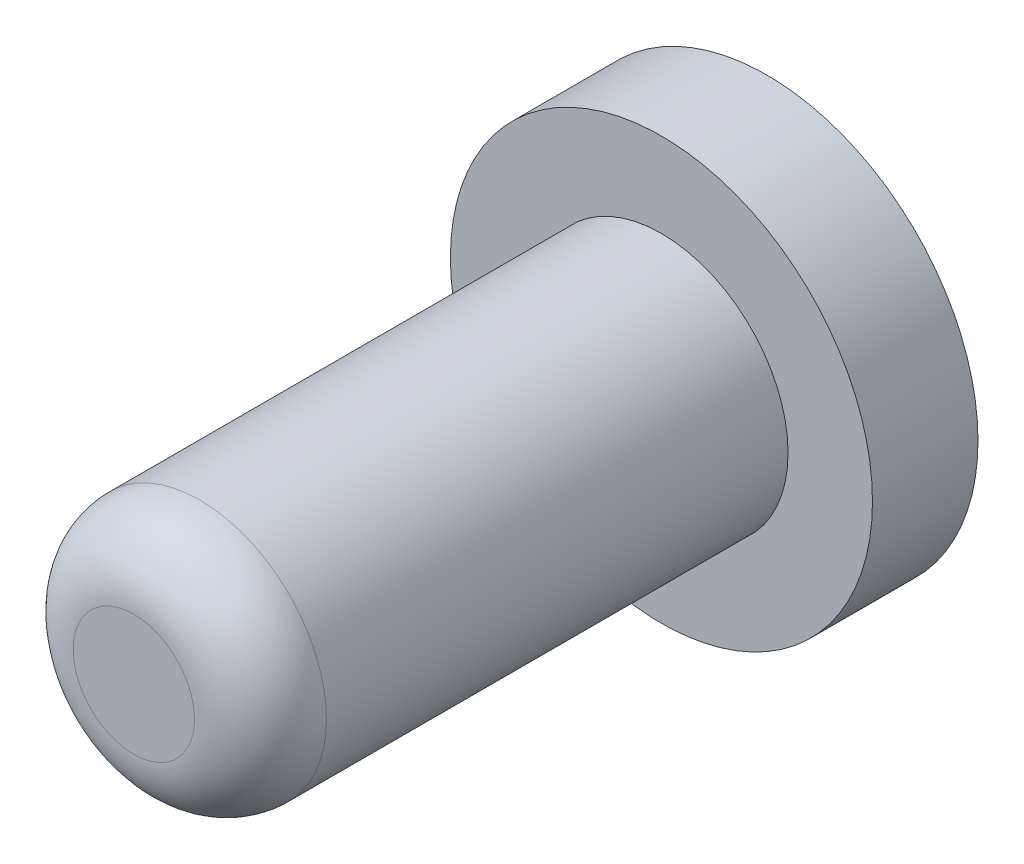
ISO-10303-21;
HEADER;
FILE_DESCRIPTION(('STEP AP214'),'2;1');
FILE_NAME('part.step','',(''),(''),'','','');
FILE_SCHEMA(('AUTOMOTIVE_DESIGN { 1 0 10303 214 1 1 1 1 }'));
ENDSEC;
DATA;
#1=APPLICATION_CONTEXT('core data for automotive mechanical design processes');
#2=APPLICATION_PROTOCOL_DEFINITION('international standard','automotive_design',2000,#1);
#3=PRODUCT_CONTEXT('',#1,'mechanical');
#4=PRODUCT('Part','Part','',(#3));
#5=PRODUCT_RELATED_PRODUCT_CATEGORY('part','',(#4));
#6=PRODUCT_DEFINITION_FORMATION('','',#4);
#7=PRODUCT_DEFINITION_CONTEXT('part definition',#1,'design');
#8=PRODUCT_DEFINITION('design','',#6,#7);
#9=PRODUCT_DEFINITION_SHAPE('','',#8);
#10=(LENGTH_UNIT() NAMED_UNIT(*) SI_UNIT(.MILLI.,.METRE.));
#11=(NAMED_UNIT(*) PLANE_ANGLE_UNIT() SI_UNIT($,.RADIAN.));
#12=(NAMED_UNIT(*) SI_UNIT($,.STERADIAN.) SOLID_ANGLE_UNIT());
#13=UNCERTAINTY_MEASURE_WITH_UNIT(LENGTH_MEASURE(1.E-05),#10,'distance_accuracy_value','');
#14=(GEOMETRIC_REPRESENTATION_CONTEXT(3) GLOBAL_UNCERTAINTY_ASSIGNED_CONTEXT((#13)) GLOBAL_UNIT_ASSIGNED_CONTEXT((#10,
#11,#12)) REPRESENTATION_CONTEXT('',''));
#15=CARTESIAN_POINT('',(0.,0.,0.));
#16=DIRECTION('',(0.,0.,1.));
#17=DIRECTION('',(1.,0.,0.));
#18=AXIS2_PLACEMENT_3D('',#15,#16,#17);
#19=CARTESIAN_POINT('',(0.,0.,-2.));
#20=DIRECTION('',(0.,0.,1.));
#21=DIRECTION('',(1.,0.,0.));
#22=AXIS2_PLACEMENT_3D('',#19,#20,#21);
#23=CYLINDRICAL_SURFACE('',#22,4.);
#24=CARTESIAN_POINT('',(0.,0.,-2.));
#25=DIRECTION('',(0.,0.,1.));
#26=DIRECTION('',(1.,0.,0.));
#27=AXIS2_PLACEMENT_3D('',#24,#25,#26);
#28=CIRCLE('',#27,4.);
#29=CARTESIAN_POINT('',(4.,0.,-2.));
#30=VERTEX_POINT('',#29);
#31=EDGE_CURVE('E49',#30,#30,#28,.T.);
#32=ORIENTED_EDGE('',*,*,#31,.T.);
#33=EDGE_LOOP('',(#32));
#34=FACE_BOUND('',#33,.T.);
#35=CARTESIAN_POINT('',(0.,0.,0.));
#36=DIRECTION('',(0.,0.,1.));
#37=DIRECTION('',(1.,0.,0.));
#38=AXIS2_PLACEMENT_3D('',#35,#36,#37);
#39=CIRCLE('',#38,4.);
#40=CARTESIAN_POINT('',(4.,0.,0.));
#41=VERTEX_POINT('',#40);
#42=EDGE_CURVE('E52',#41,#41,#39,.T.);
#43=ORIENTED_EDGE('',*,*,#42,.F.);
#44=EDGE_LOOP('',(#43));
#45=FACE_BOUND('',#44,.T.);
#46=ADVANCED_FACE('F34',(#34,#45),#23,.T.);
#47=CARTESIAN_POINT('',(0.,0.,-2.));
#48=DIRECTION('',(0.,0.,1.));
#49=DIRECTION('',(1.,0.,0.));
#50=AXIS2_PLACEMENT_3D('',#47,#48,#49);
#51=PLANE('',#50);
#52=ORIENTED_EDGE('',*,*,#31,.F.);
#53=EDGE_LOOP('',(#52));
#54=FACE_BOUND('',#53,.T.);
#55=ADVANCED_FACE('F60',(#54),#51,.F.);
#56=CARTESIAN_POINT('',(0.,0.,0.));
#57=DIRECTION('',(0.,0.,1.));
#58=DIRECTION('',(1.,0.,0.));
#59=AXIS2_PLACEMENT_3D('',#56,#57,#58);
#60=PLANE('',#59);
#61=CARTESIAN_POINT('',(0.,0.,0.));
#62=DIRECTION('',(0.,0.,1.));
#63=DIRECTION('',(1.,0.,0.));
#64=AXIS2_PLACEMENT_3D('',#61,#62,#63);
#65=CIRCLE('',#64,2.4);
#66=CARTESIAN_POINT('',(2.4,0.,0.));
#67=VERTEX_POINT('',#66);
#68=EDGE_CURVE('E45',#67,#67,#65,.T.);
#69=ORIENTED_EDGE('',*,*,#68,.F.);
#70=EDGE_LOOP('',(#69));
#71=FACE_BOUND('',#70,.T.);
#72=ORIENTED_EDGE('',*,*,#42,.T.);
#73=EDGE_LOOP('',(#72));
#74=FACE_BOUND('',#73,.T.);
#75=ADVANCED_FACE('F62',(#71,#74),#60,.T.);
#76=CARTESIAN_POINT('',(0.,0.,10.));
#77=DIRECTION('',(0.,0.,-1.));
#78=DIRECTION('',(-1.,0.,0.));
#79=AXIS2_PLACEMENT_3D('',#76,#77,#78);
#80=CYLINDRICAL_SURFACE('',#79,2.4);
#81=CARTESIAN_POINT('',(0.,0.,8.75));
#82=DIRECTION('',(0.,0.,1.));
#83=DIRECTION('',(1.,0.,0.));
#84=AXIS2_PLACEMENT_3D('',#81,#82,#83);
#85=CIRCLE('',#84,2.4);
#86=CARTESIAN_POINT('',(2.4,0.,8.75));
#87=VERTEX_POINT('',#86);
#88=EDGE_CURVE('E10',#87,#87,#85,.F.);
#89=ORIENTED_EDGE('',*,*,#88,.T.);
#90=EDGE_LOOP('',(#89));
#91=FACE_BOUND('',#90,.T.);
#92=ORIENTED_EDGE('',*,*,#68,.T.);
#93=EDGE_LOOP('',(#92));
#94=FACE_BOUND('',#93,.T.);
#95=ADVANCED_FACE('F68',(#91,#94),#80,.T.);
#96=CARTESIAN_POINT('',(0.,0.,10.));
#97=DIRECTION('',(0.,0.,1.));
#98=DIRECTION('',(1.,0.,0.));
#99=AXIS2_PLACEMENT_3D('',#96,#97,#98);
#100=PLANE('',#99);
#101=CARTESIAN_POINT('',(0.,0.,10.));
#102=DIRECTION('',(0.,0.,1.));
#103=DIRECTION('',(1.,0.,0.));
#104=AXIS2_PLACEMENT_3D('',#101,#102,#103);
#105=CIRCLE('',#104,1.15);
#106=CARTESIAN_POINT('',(1.15,0.,10.));
#107=VERTEX_POINT('',#106);
#108=EDGE_CURVE('E41',#107,#107,#105,.T.);
#109=ORIENTED_EDGE('',*,*,#108,.T.);
#110=EDGE_LOOP('',(#109));
#111=FACE_BOUND('',#110,.T.);
#112=ADVANCED_FACE('F74',(#111),#100,.T.);
#113=CARTESIAN_POINT('',(0.,0.,8.75));
#114=DIRECTION('',(0.,0.,1.));
#115=DIRECTION('',(1.,0.,0.));
#116=AXIS2_PLACEMENT_3D('',#113,#114,#115);
#117=DEGENERATE_TOROIDAL_SURFACE('',#116,1.15,1.25,.T.);
#118=ORIENTED_EDGE('',*,*,#88,.F.);
#119=EDGE_LOOP('',(#118));
#120=FACE_BOUND('',#119,.T.);
#121=ORIENTED_EDGE('',*,*,#108,.F.);
#122=EDGE_LOOP('',(#121));
#123=FACE_BOUND('',#122,.T.);
#124=ADVANCED_FACE('F36',(#120,#123),#117,.T.);
#125=CLOSED_SHELL('',(#46,#55,#75,#95,#112,#124));
#126=MANIFOLD_SOLID_BREP('B2',#125);
#127=ADVANCED_BREP_SHAPE_REPRESENTATION('',(#18,#126),#14);
#128=SHAPE_DEFINITION_REPRESENTATION(#9,#127);
ENDSEC;
END-ISO-10303-21;
